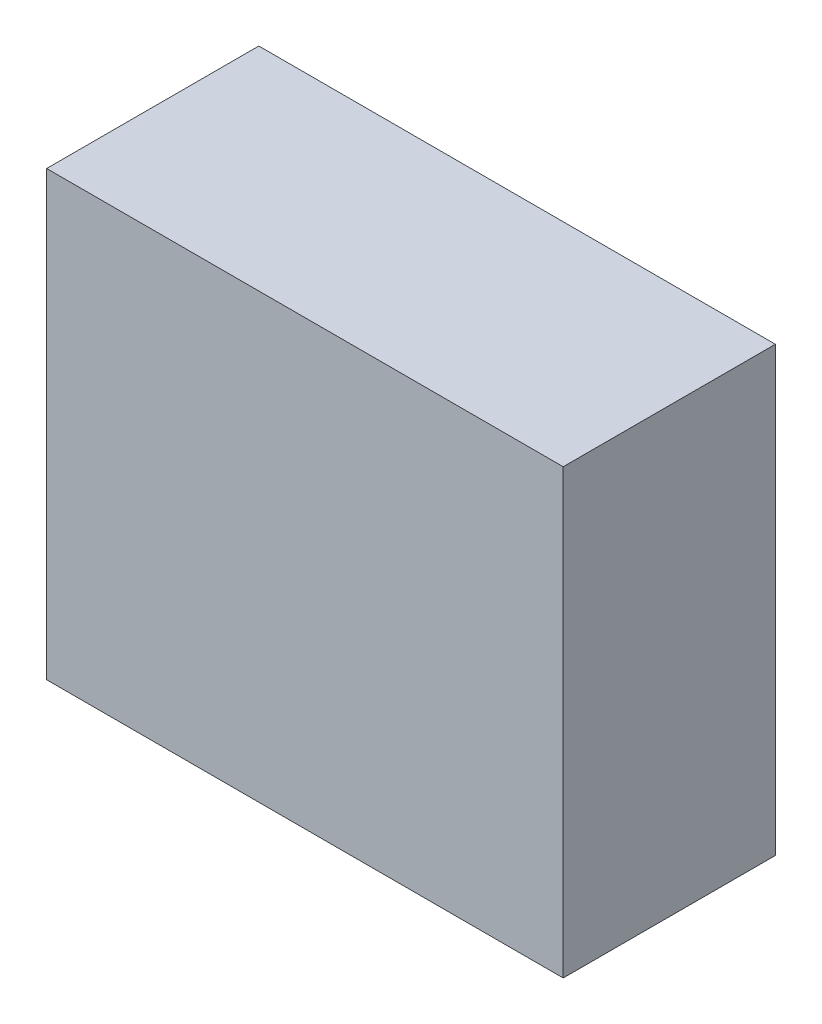
ISO-10303-21;
HEADER;
FILE_DESCRIPTION(('STEP AP214'),'2;1');
FILE_NAME('part.step','',(''),(''),'','','');
FILE_SCHEMA(('AUTOMOTIVE_DESIGN { 1 0 10303 214 1 1 1 1 }'));
ENDSEC;
DATA;
#1=APPLICATION_CONTEXT('core data for automotive mechanical design processes');
#2=APPLICATION_PROTOCOL_DEFINITION('international standard','automotive_design',2000,#1);
#3=PRODUCT_CONTEXT('',#1,'mechanical');
#4=PRODUCT('Part','Part','',(#3));
#5=PRODUCT_RELATED_PRODUCT_CATEGORY('part','',(#4));
#6=PRODUCT_DEFINITION_FORMATION('','',#4);
#7=PRODUCT_DEFINITION_CONTEXT('part definition',#1,'design');
#8=PRODUCT_DEFINITION('design','',#6,#7);
#9=PRODUCT_DEFINITION_SHAPE('','',#8);
#10=(LENGTH_UNIT() NAMED_UNIT(*) SI_UNIT(.MILLI.,.METRE.));
#11=(NAMED_UNIT(*) PLANE_ANGLE_UNIT() SI_UNIT($,.RADIAN.));
#12=(NAMED_UNIT(*) SI_UNIT($,.STERADIAN.) SOLID_ANGLE_UNIT());
#13=UNCERTAINTY_MEASURE_WITH_UNIT(LENGTH_MEASURE(1.E-05),#10,'distance_accuracy_value','');
#14=(GEOMETRIC_REPRESENTATION_CONTEXT(3) GLOBAL_UNCERTAINTY_ASSIGNED_CONTEXT((#13)) GLOBAL_UNIT_ASSIGNED_CONTEXT((#10,
#11,#12)) REPRESENTATION_CONTEXT('',''));
#15=CARTESIAN_POINT('',(0.,0.,0.));
#16=DIRECTION('',(0.,0.,1.));
#17=DIRECTION('',(1.,0.,0.));
#18=AXIS2_PLACEMENT_3D('',#15,#16,#17);
#19=CARTESIAN_POINT('',(-4.63436876603021,24.,-4.39655172413793));
#20=DIRECTION('',(1.,0.,0.));
#21=DIRECTION('',(0.,0.,-1.));
#22=AXIS2_PLACEMENT_3D('',#19,#20,#21);
#23=PLANE('',#22);
#24=DIRECTION('',(0.,0.,1.));
#25=VECTOR('',#24,1.);
#26=CARTESIAN_POINT('',(-4.63436876603021,0.,-4.39655172413793));
#27=LINE('',#26,#25);
#28=CARTESIAN_POINT('',(-4.63436876603021,0.,-4.39655172413793));
#29=VERTEX_POINT('',#28);
#30=CARTESIAN_POINT('',(-4.63436876603021,0.,7.10344827586207));
#31=VERTEX_POINT('',#30);
#32=EDGE_CURVE('E113',#29,#31,#27,.T.);
#33=ORIENTED_EDGE('',*,*,#32,.T.);
#34=DIRECTION('',(0.,-1.,0.));
#35=VECTOR('',#34,1.);
#36=CARTESIAN_POINT('',(-4.63436876603021,24.,7.10344827586207));
#37=LINE('',#36,#35);
#38=CARTESIAN_POINT('',(-4.63436876603021,24.,7.10344827586207));
#39=VERTEX_POINT('',#38);
#40=EDGE_CURVE('E11',#39,#31,#37,.T.);
#41=ORIENTED_EDGE('',*,*,#40,.F.);
#42=DIRECTION('',(0.,0.,1.));
#43=VECTOR('',#42,1.);
#44=CARTESIAN_POINT('',(-4.63436876603021,24.,-4.39655172413793));
#45=LINE('',#44,#43);
#46=CARTESIAN_POINT('',(-4.63436876603021,24.,-4.39655172413793));
#47=VERTEX_POINT('',#46);
#48=EDGE_CURVE('E97',#47,#39,#45,.T.);
#49=ORIENTED_EDGE('',*,*,#48,.F.);
#50=DIRECTION('',(0.,-1.,0.));
#51=VECTOR('',#50,1.);
#52=CARTESIAN_POINT('',(-4.63436876603021,24.,-4.39655172413793));
#53=LINE('',#52,#51);
#54=EDGE_CURVE('E109',#47,#29,#53,.T.);
#55=ORIENTED_EDGE('',*,*,#54,.T.);
#56=EDGE_LOOP('',(#33,#41,#49,#55));
#57=FACE_BOUND('',#56,.T.);
#58=ADVANCED_FACE('F45',(#57),#23,.F.);
#59=CARTESIAN_POINT('',(-4.63436876603021,24.,7.10344827586207));
#60=DIRECTION('',(0.,0.,-1.));
#61=DIRECTION('',(-1.,0.,0.));
#62=AXIS2_PLACEMENT_3D('',#59,#60,#61);
#63=PLANE('',#62);
#64=DIRECTION('',(1.,0.,0.));
#65=VECTOR('',#64,1.);
#66=CARTESIAN_POINT('',(-4.63436876603021,0.,7.10344827586207));
#67=LINE('',#66,#65);
#68=CARTESIAN_POINT('',(23.3656312339698,0.,7.10344827586207));
#69=VERTEX_POINT('',#68);
#70=EDGE_CURVE('E102',#31,#69,#67,.T.);
#71=ORIENTED_EDGE('',*,*,#70,.T.);
#72=DIRECTION('',(0.,-1.,0.));
#73=VECTOR('',#72,1.);
#74=CARTESIAN_POINT('',(23.3656312339698,24.,7.10344827586207));
#75=LINE('',#74,#73);
#76=CARTESIAN_POINT('',(23.3656312339698,24.,7.10344827586207));
#77=VERTEX_POINT('',#76);
#78=EDGE_CURVE('E54',#77,#69,#75,.T.);
#79=ORIENTED_EDGE('',*,*,#78,.F.);
#80=DIRECTION('',(1.,0.,0.));
#81=VECTOR('',#80,1.);
#82=CARTESIAN_POINT('',(-4.63436876603021,24.,7.10344827586207));
#83=LINE('',#82,#81);
#84=EDGE_CURVE('E92',#39,#77,#83,.T.);
#85=ORIENTED_EDGE('',*,*,#84,.F.);
#86=ORIENTED_EDGE('',*,*,#40,.T.);
#87=EDGE_LOOP('',(#71,#79,#85,#86));
#88=FACE_BOUND('',#87,.T.);
#89=ADVANCED_FACE('F101',(#88),#63,.F.);
#90=CARTESIAN_POINT('',(23.3656312339698,24.,-4.39655172413793));
#91=DIRECTION('',(-1.,0.,0.));
#92=DIRECTION('',(0.,0.,1.));
#93=AXIS2_PLACEMENT_3D('',#90,#91,#92);
#94=PLANE('',#93);
#95=DIRECTION('',(0.,0.,-1.));
#96=VECTOR('',#95,1.);
#97=CARTESIAN_POINT('',(23.3656312339698,0.,-4.39655172413793));
#98=LINE('',#97,#96);
#99=CARTESIAN_POINT('',(23.3656312339698,0.,-4.39655172413793));
#100=VERTEX_POINT('',#99);
#101=EDGE_CURVE('E79',#69,#100,#98,.T.);
#102=ORIENTED_EDGE('',*,*,#101,.T.);
#103=DIRECTION('',(0.,-1.,0.));
#104=VECTOR('',#103,1.);
#105=CARTESIAN_POINT('',(23.3656312339698,24.,-4.39655172413793));
#106=LINE('',#105,#104);
#107=CARTESIAN_POINT('',(23.3656312339698,24.,-4.39655172413793));
#108=VERTEX_POINT('',#107);
#109=EDGE_CURVE('E104',#108,#100,#106,.T.);
#110=ORIENTED_EDGE('',*,*,#109,.F.);
#111=DIRECTION('',(0.,0.,-1.));
#112=VECTOR('',#111,1.);
#113=CARTESIAN_POINT('',(23.3656312339698,24.,-4.39655172413793));
#114=LINE('',#113,#112);
#115=EDGE_CURVE('E95',#77,#108,#114,.T.);
#116=ORIENTED_EDGE('',*,*,#115,.F.);
#117=ORIENTED_EDGE('',*,*,#78,.T.);
#118=EDGE_LOOP('',(#102,#110,#116,#117));
#119=FACE_BOUND('',#118,.T.);
#120=ADVANCED_FACE('F105',(#119),#94,.F.);
#121=CARTESIAN_POINT('',(-4.63436876603021,24.,-4.39655172413793));
#122=DIRECTION('',(0.,0.,1.));
#123=DIRECTION('',(1.,0.,0.));
#124=AXIS2_PLACEMENT_3D('',#121,#122,#123);
#125=PLANE('',#124);
#126=DIRECTION('',(-1.,0.,0.));
#127=VECTOR('',#126,1.);
#128=CARTESIAN_POINT('',(-4.63436876603021,0.,-4.39655172413793));
#129=LINE('',#128,#127);
#130=EDGE_CURVE('E85',#100,#29,#129,.T.);
#131=ORIENTED_EDGE('',*,*,#130,.T.);
#132=ORIENTED_EDGE('',*,*,#54,.F.);
#133=DIRECTION('',(-1.,0.,0.));
#134=VECTOR('',#133,1.);
#135=CARTESIAN_POINT('',(-4.63436876603021,24.,-4.39655172413793));
#136=LINE('',#135,#134);
#137=EDGE_CURVE('E62',#108,#47,#136,.T.);
#138=ORIENTED_EDGE('',*,*,#137,.F.);
#139=ORIENTED_EDGE('',*,*,#109,.T.);
#140=EDGE_LOOP('',(#131,#132,#138,#139));
#141=FACE_BOUND('',#140,.T.);
#142=ADVANCED_FACE('F126',(#141),#125,.F.);
#143=CARTESIAN_POINT('',(0.,24.,0.));
#144=DIRECTION('',(0.,1.,0.));
#145=DIRECTION('',(0.,0.,1.));
#146=AXIS2_PLACEMENT_3D('',#143,#144,#145);
#147=PLANE('',#146);
#148=ORIENTED_EDGE('',*,*,#48,.T.);
#149=ORIENTED_EDGE('',*,*,#84,.T.);
#150=ORIENTED_EDGE('',*,*,#115,.T.);
#151=ORIENTED_EDGE('',*,*,#137,.T.);
#152=EDGE_LOOP('',(#148,#149,#150,#151));
#153=FACE_BOUND('',#152,.T.);
#154=ADVANCED_FACE('F93',(#153),#147,.T.);
#155=CARTESIAN_POINT('',(0.,0.,0.));
#156=DIRECTION('',(0.,1.,0.));
#157=DIRECTION('',(0.,0.,1.));
#158=AXIS2_PLACEMENT_3D('',#155,#156,#157);
#159=PLANE('',#158);
#160=ORIENTED_EDGE('',*,*,#32,.F.);
#161=ORIENTED_EDGE('',*,*,#130,.F.);
#162=ORIENTED_EDGE('',*,*,#101,.F.);
#163=ORIENTED_EDGE('',*,*,#70,.F.);
#164=EDGE_LOOP('',(#160,#161,#162,#163));
#165=FACE_BOUND('',#164,.T.);
#166=ADVANCED_FACE('F129',(#165),#159,.F.);
#167=CLOSED_SHELL('',(#58,#89,#120,#142,#154,#166));
#168=MANIFOLD_SOLID_BREP('B2',#167);
#169=ADVANCED_BREP_SHAPE_REPRESENTATION('',(#18,#168),#14);
#170=SHAPE_DEFINITION_REPRESENTATION(#9,#169);
ENDSEC;
END-ISO-10303-21;
